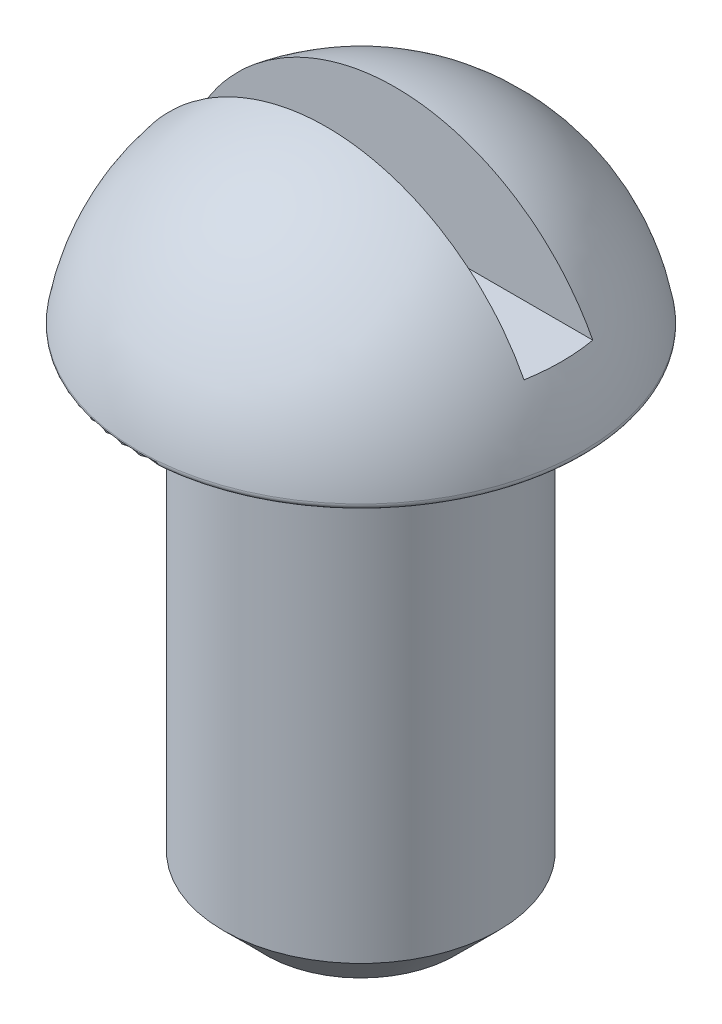
ISO-10303-21;
HEADER;
FILE_DESCRIPTION(('STEP AP214'),'2;1');
FILE_NAME('part.step','',(''),(''),'','','');
FILE_SCHEMA(('AUTOMOTIVE_DESIGN { 1 0 10303 214 1 1 1 1 }'));
ENDSEC;
DATA;
#1=APPLICATION_CONTEXT('core data for automotive mechanical design processes');
#2=APPLICATION_PROTOCOL_DEFINITION('international standard','automotive_design',2000,#1);
#3=PRODUCT_CONTEXT('',#1,'mechanical');
#4=PRODUCT('Part','Part','',(#3));
#5=PRODUCT_RELATED_PRODUCT_CATEGORY('part','',(#4));
#6=PRODUCT_DEFINITION_FORMATION('','',#4);
#7=PRODUCT_DEFINITION_CONTEXT('part definition',#1,'design');
#8=PRODUCT_DEFINITION('design','',#6,#7);
#9=PRODUCT_DEFINITION_SHAPE('','',#8);
#10=(LENGTH_UNIT() NAMED_UNIT(*) SI_UNIT(.MILLI.,.METRE.));
#11=(NAMED_UNIT(*) PLANE_ANGLE_UNIT() SI_UNIT($,.RADIAN.));
#12=(NAMED_UNIT(*) SI_UNIT($,.STERADIAN.) SOLID_ANGLE_UNIT());
#13=UNCERTAINTY_MEASURE_WITH_UNIT(LENGTH_MEASURE(1.E-05),#10,'distance_accuracy_value','');
#14=(GEOMETRIC_REPRESENTATION_CONTEXT(3) GLOBAL_UNCERTAINTY_ASSIGNED_CONTEXT((#13)) GLOBAL_UNIT_ASSIGNED_CONTEXT((#10,
#11,#12)) REPRESENTATION_CONTEXT('',''));
#15=CARTESIAN_POINT('',(0.,0.,0.));
#16=DIRECTION('',(0.,0.,1.));
#17=DIRECTION('',(1.,0.,0.));
#18=AXIS2_PLACEMENT_3D('',#15,#16,#17);
#19=CARTESIAN_POINT('',(0.,87.7311012827133,0.));
#20=DIRECTION('',(0.,1.,0.));
#21=DIRECTION('',(-1.,0.,0.));
#22=AXIS2_PLACEMENT_3D('',#19,#20,#21);
#23=DEGENERATE_TOROIDAL_SURFACE('',#22,0.0358157092389795,6.6,.F.);
#24=CARTESIAN_POINT('',(0.,88.8241552762176,0.));
#25=DIRECTION('',(0.,-1.,0.));
#26=DIRECTION('',(1.,0.,0.));
#27=AXIS2_PLACEMENT_3D('',#24,#25,#26);
#28=CIRCLE('',#27,6.47304232940991);
#29=CARTESIAN_POINT('',(6.4730423294099,88.8241552762176,0.));
#30=VERTEX_POINT('',#29);
#31=EDGE_CURVE('E109',#30,#30,#28,.F.);
#32=ORIENTED_EDGE('',*,*,#31,.T.);
#33=EDGE_LOOP('',(#32));
#34=FACE_BOUND('',#33,.T.);
#35=CARTESIAN_POINT('',(0.,90.7493131400015,0.));
#36=DIRECTION('',(0.,1.,0.));
#37=DIRECTION('',(0.,0.,1.));
#38=AXIS2_PLACEMENT_3D('',#35,#36,#37);
#39=CIRCLE('',#38,5.83363036211429);
#40=CARTESIAN_POINT('',(5.7472813748573,90.7493131400015,0.999999999999999));
#41=VERTEX_POINT('',#40);
#42=CARTESIAN_POINT('',(5.7472813748573,90.7493131400015,-1.));
#43=VERTEX_POINT('',#42);
#44=EDGE_CURVE('E59',#41,#43,#39,.T.);
#45=ORIENTED_EDGE('',*,*,#44,.F.);
#46=CARTESIAN_POINT('',(0.,94.2493131400015,1.));
#47=CARTESIAN_POINT('',(-0.168364600788995,94.2493097063056,1.));
#48=CARTESIAN_POINT('',(-0.336764614827509,94.2425338725873,1.));
#49=CARTESIAN_POINT('',(-0.672512587075678,94.2156406275623,1.));
#50=CARTESIAN_POINT('',(-0.839860019882909,94.1955170162685,1.));
#51=CARTESIAN_POINT('',(-1.34257996888222,94.1149353824897,1.));
#52=CARTESIAN_POINT('',(-1.67494968150842,94.0342740760953,1.));
#53=CARTESIAN_POINT('',(-2.32319170329427,93.8218496667167,1.));
#54=CARTESIAN_POINT('',(-2.63904225223267,93.6900209952112,1.));
#55=CARTESIAN_POINT('',(-3.26755910495227,93.3676156673305,1.));
#56=CARTESIAN_POINT('',(-3.5784596531921,93.1735767044572,1.));
#57=CARTESIAN_POINT('',(-4.16336688716754,92.7362792981311,1.));
#58=CARTESIAN_POINT('',(-4.43737726797557,92.4930257903295,1.));
#59=CARTESIAN_POINT('',(-4.94188801677566,91.96308272381,1.));
#60=CARTESIAN_POINT('',(-5.17221167247878,91.676224867786,1.));
#61=CARTESIAN_POINT('',(-5.58145765988647,91.0679036589879,1.));
#62=CARTESIAN_POINT('',(-5.76037817589664,90.7464390843644,1.));
#63=CARTESIAN_POINT('',(-6.06180216459337,90.0779623416771,1.));
#64=CARTESIAN_POINT('',(-6.18428289306651,89.7309399394924,1.));
#65=CARTESIAN_POINT('',(-6.36924115668387,89.0210602049794,1.));
#66=CARTESIAN_POINT('',(-6.43171901342573,88.6582029575322,1.));
#67=CARTESIAN_POINT('',(-6.47913187611613,88.1102620339645,1.));
#68=CARTESIAN_POINT('',(-6.48721002986995,87.9268979904018,1.));
#69=CARTESIAN_POINT('',(-6.48789872749039,87.5601590038382,1.));
#70=CARTESIAN_POINT('',(-6.48051497722519,87.3767840898207,1.));
#71=CARTESIAN_POINT('',(-6.45032037412489,87.0112534255423,1.));
#72=CARTESIAN_POINT('',(-6.42750381484928,86.8290981514253,1.));
#73=CARTESIAN_POINT('',(-6.36661603526718,86.4674210656236,1.));
#74=CARTESIAN_POINT('',(-6.32855044842673,86.2878983067663,1.));
#75=CARTESIAN_POINT('',(-6.23741635847207,85.9326300027914,1.));
#76=CARTESIAN_POINT('',(-6.1843421444511,85.756885922936,1.));
#77=CARTESIAN_POINT('',(-6.06359675062446,85.4105585109484,1.));
#78=CARTESIAN_POINT('',(-5.99593096575019,85.2399732979403,1.));
#79=CARTESIAN_POINT('',(-5.84644350576554,84.9050459137871,1.));
#80=CARTESIAN_POINT('',(-5.76461654906622,84.7407060999331,1.));
#81=CARTESIAN_POINT('',(-5.58743866370309,84.4195652814166,1.));
#82=CARTESIAN_POINT('',(-5.49209273896502,84.2627615159787,1.));
#83=CARTESIAN_POINT('',(-5.28849624967184,83.9576899389117,1.));
#84=CARTESIAN_POINT('',(-5.18024124146737,83.8094250928008,1.));
#85=CARTESIAN_POINT('',(-4.95166469274388,83.5225981269001,1.));
#86=CARTESIAN_POINT('',(-4.83134762313617,83.3840324441326,1.));
#87=CARTESIAN_POINT('',(-4.57942517498899,83.1174837661509,1.));
#88=CARTESIAN_POINT('',(-4.44781596214704,82.9895043947738,1.));
#89=CARTESIAN_POINT('',(-4.17433055756216,82.7451378815595,1.));
#90=CARTESIAN_POINT('',(-4.03245817855574,82.6287464726252,1.));
#91=CARTESIAN_POINT('',(-3.73938801669753,82.408314235322,1.));
#92=CARTESIAN_POINT('',(-3.58818878440258,82.3042753339841,1.));
#93=CARTESIAN_POINT('',(-3.27761638725377,82.1093485489183,1.));
#94=CARTESIAN_POINT('',(-3.11824626979921,82.0184558098565,1.));
#95=CARTESIAN_POINT('',(-2.79235644915646,81.8503990245377,1.));
#96=CARTESIAN_POINT('',(-2.62583435328378,81.7732396178625,1.));
#97=CARTESIAN_POINT('',(-2.28687145500087,81.633246712472,1.));
#98=CARTESIAN_POINT('',(-2.11443060470902,81.5704133296829,1.));
#99=CARTESIAN_POINT('',(-1.7649532065626,81.4595743448906,1.));
#100=CARTESIAN_POINT('',(-1.58791929248437,81.4115604402123,1.));
#101=CARTESIAN_POINT('',(-1.23041628721557,81.3307067395205,1.));
#102=CARTESIAN_POINT('',(-1.04994717105947,81.2978670538304,1.));
#103=CARTESIAN_POINT('',(-0.686918399405601,81.2477308039299,1.));
#104=CARTESIAN_POINT('',(-0.504359470066674,81.230428997339,1.));
#105=CARTESIAN_POINT('',(-0.138433424931248,81.2117610586447,1.));
#106=CARTESIAN_POINT('',(0.0449336356931564,81.2103938550234,1.));
#107=CARTESIAN_POINT('',(0.407926267112874,81.223531179399,1.));
#108=CARTESIAN_POINT('',(0.587561864101404,81.2377626251395,1.));
#109=CARTESIAN_POINT('',(0.945002655472167,81.2812896524057,1.));
#110=CARTESIAN_POINT('',(1.12280774522417,81.3105860902105,1.));
#111=CARTESIAN_POINT('',(1.47537431337237,81.3838998315108,1.));
#112=CARTESIAN_POINT('',(1.6501354602263,81.4279187281385,1.));
#113=CARTESIAN_POINT('',(1.99546226512214,81.530333467473,1.));
#114=CARTESIAN_POINT('',(2.1660263440498,81.5887346331047,1.));
#115=CARTESIAN_POINT('',(2.50264831497619,81.7198383957288,1.));
#116=CARTESIAN_POINT('',(2.66867626132882,81.7926178883556,1.));
#117=CARTESIAN_POINT('',(2.99415102511854,81.9517831672321,1.));
#118=CARTESIAN_POINT('',(3.15359543158032,82.038173883276,1.));
#119=CARTESIAN_POINT('',(3.46465420270729,82.2238883285555,1.));
#120=CARTESIAN_POINT('',(3.61627254928623,82.3232053884229,1.));
#121=CARTESIAN_POINT('',(3.91077086513253,82.5341528225777,1.));
#122=CARTESIAN_POINT('',(4.05364758775263,82.645787729087,1.));
#123=CARTESIAN_POINT('',(4.33114521833971,82.8818693508057,1.));
#124=CARTESIAN_POINT('',(4.46565682650613,83.0064445735642,1.));
#125=CARTESIAN_POINT('',(4.72376592506991,83.2665220900527,1.));
#126=CARTESIAN_POINT('',(4.84735932542795,83.4020284426011,1.));
#127=CARTESIAN_POINT('',(5.08266643134184,83.6829259995811,1.));
#128=CARTESIAN_POINT('',(5.19438344944847,83.8283144290664,1.));
#129=CARTESIAN_POINT('',(5.4052240657419,84.1280328013535,1.));
#130=CARTESIAN_POINT('',(5.50434299561551,84.2823660280494,0.999999999999999));
#131=CARTESIAN_POINT('',(5.68926860081707,84.5988864795695,0.999999999999999));
#132=CARTESIAN_POINT('',(5.77507053699852,84.7610764735788,0.999999999999999));
#133=CARTESIAN_POINT('',(5.93273966071617,85.0921637845613,0.999999999999999));
#134=CARTESIAN_POINT('',(6.00460168892334,85.2610635571464,0.999999999999999));
#135=CARTESIAN_POINT('',(6.13381547226178,85.6042632311459,0.999999999999999));
#136=CARTESIAN_POINT('',(6.19117289390311,85.7785609937652,0.999999999999999));
#137=CARTESIAN_POINT('',(6.29102538822153,86.1313816409077,0.999999999999999));
#138=CARTESIAN_POINT('',(6.33351496564768,86.3099060616574,0.999999999999999));
#139=CARTESIAN_POINT('',(6.43812787390145,86.8498503717252,0.999999999999999));
#140=CARTESIAN_POINT('',(6.47751597236955,87.2159624773144,0.999999999999999));
#141=CARTESIAN_POINT('',(6.49423907863785,87.9494055895346,0.999999999999999));
#142=CARTESIAN_POINT('',(6.47157387249278,88.3167366003638,0.999999999999999));
#143=CARTESIAN_POINT('',(6.36490463855243,89.0424400512681,0.999999999999999));
#144=CARTESIAN_POINT('',(6.28089949284236,89.4008123279479,0.999999999999999));
#145=CARTESIAN_POINT('',(6.05391064511335,90.0983605844038,0.999999999999999));
#146=CARTESIAN_POINT('',(5.91092561336796,90.4375361311853,0.999999999999999));
#147=CARTESIAN_POINT('',(5.57003345761879,91.0870820336162,0.999999999999999));
#148=CARTESIAN_POINT('',(5.37212427346706,91.3974513081892,1.));
#149=CARTESIAN_POINT('',(4.92702909397013,91.98051149022,1.));
#150=CARTESIAN_POINT('',(4.67984976478793,92.253207486364,1.));
#151=CARTESIAN_POINT('',(4.14330966611572,92.7531361219875,1.));
#152=CARTESIAN_POINT('',(3.8539635562366,92.9803844968148,1.));
#153=CARTESIAN_POINT('',(3.24100871245393,93.383202345997,1.));
#154=CARTESIAN_POINT('',(2.91737851217774,93.5587391789482,1.));
#155=CARTESIAN_POINT('',(2.24510461371918,93.8529605739998,1.));
#156=CARTESIAN_POINT('',(1.8964483624946,93.9716163722521,1.));
#157=CARTESIAN_POINT('',(1.18469830477155,94.1481985716486,1.));
#158=CARTESIAN_POINT('',(0.821641932319893,94.2062729329426,1.));
#159=CARTESIAN_POINT('',(0.304707613220261,94.2437727105078,1.));
#160=CARTESIAN_POINT('',(0.15236830846339,94.2493162474626,1.));
#161=CARTESIAN_POINT('',(0.,94.2493131400015,1.));
#162=B_SPLINE_CURVE_WITH_KNOTS('',3,(#46,#47,#48,#49,#50,#51,#52,#53,#54,#55,#56,#57,#58,#59,
#60,#61,#62,#63,#64,#65,#66,#67,#68,#69,#70,#71,#72,#73,#74,#75,#76,#77,#78,#79,#80,#81,#82,#83,
#84,#85,#86,#87,#88,#89,#90,#91,#92,#93,#94,#95,#96,#97,#98,#99,#100,#101,#102,#103,#104,#105,
#106,#107,#108,#109,#110,#111,#112,#113,#114,#115,#116,#117,#118,#119,#120,#121,#122,#123,#124,
#125,#126,#127,#128,#129,#130,#131,#132,#133,#134,#135,#136,#137,#138,#139,#140,#141,#142,#143,
#144,#145,#146,#147,#148,#149,#150,#151,#152,#153,#154,#155,#156,#157,#158,#159,#160,#161),
.UNSPECIFIED.,.T.,.F.,(4,2,2,2,2,2,2,2,2,2,2,2,2,2,2,2,2,2,2,2,2,2,2,2,2,2,2,2,2,2,2,2,2,2,2,2,
2,2,2,2,2,2,2,2,2,2,2,2,2,2,2,2,2,2,2,2,2,4),(0.,0.505004664153804,1.01024406529592,
2.03164274769624,3.05435464793472,4.14855255160085,5.24264077418811,6.34106435763797,
7.43952673553505,8.53843138761712,9.63733014986245,10.1874208625397,10.7373086123768,
11.2873998001212,11.8372879541698,12.3873856274042,12.9372802610614,13.4873804286424,
14.0372775105171,14.587364430973,15.1372482053783,15.6873194400863,16.2371873640745,
16.787140956834,17.3368909111158,17.8868262383649,18.4367660155395,18.986397125013,
19.5360322304888,20.0854818228742,20.6348944674665,21.1748401000901,21.7148164260761,
22.2548512023629,22.7950861484559,23.3382925606621,23.8816961688076,24.4248205102535,
24.9681453591822,25.5175037960906,26.0670671615976,26.6164768389346,27.1660895141232,
27.715897334859,28.2659082594997,28.8157039784342,29.3657026912946,30.4646839010472,
31.5636688998344,32.6626739280225,33.7617037350977,34.8607747712132,35.9596972057836,
37.0582384987901,38.1574717354358,39.2572602522702,40.3543563834213,40.811380639605),.UNSPECIFIED.);
#163=CARTESIAN_POINT('',(-5.74728137485732,90.7493131400015,1.));
#164=VERTEX_POINT('',#163);
#165=EDGE_CURVE('E57',#41,#164,#162,.T.);
#166=ORIENTED_EDGE('',*,*,#165,.T.);
#167=CARTESIAN_POINT('',(-5.74728137485732,90.7493131400015,-0.999999999999999));
#168=VERTEX_POINT('',#167);
#169=EDGE_CURVE('E58',#168,#164,#39,.T.);
#170=ORIENTED_EDGE('',*,*,#169,.F.);
#171=CARTESIAN_POINT('',(0.,94.2493131400015,-1.));
#172=CARTESIAN_POINT('',(0.168364600788981,94.2493097063056,-1.));
#173=CARTESIAN_POINT('',(0.336764614827495,94.2425338725873,-1.));
#174=CARTESIAN_POINT('',(0.672512587075663,94.2156406275623,-1.));
#175=CARTESIAN_POINT('',(0.839860019882895,94.1955170162685,-1.));
#176=CARTESIAN_POINT('',(1.34257996888221,94.1149353824897,-1.));
#177=CARTESIAN_POINT('',(1.67494968150841,94.0342740760953,-1.));
#178=CARTESIAN_POINT('',(2.32319170329425,93.8218496667167,-1.));
#179=CARTESIAN_POINT('',(2.63904225223266,93.6900209952112,-1.));
#180=CARTESIAN_POINT('',(3.26755910495226,93.3676156673305,-1.));
#181=CARTESIAN_POINT('',(3.57845965319209,93.1735767044572,-1.));
#182=CARTESIAN_POINT('',(4.16336688716753,92.7362792981311,-1.));
#183=CARTESIAN_POINT('',(4.43737726797556,92.4930257903295,-1.));
#184=CARTESIAN_POINT('',(4.94188801677564,91.96308272381,-1.));
#185=CARTESIAN_POINT('',(5.17221167247877,91.676224867786,-1.));
#186=CARTESIAN_POINT('',(5.58145765988646,91.0679036589879,-1.));
#187=CARTESIAN_POINT('',(5.76037817589663,90.7464390843644,-1.));
#188=CARTESIAN_POINT('',(6.06180216459336,90.0779623416771,-1.));
#189=CARTESIAN_POINT('',(6.18428289306649,89.7309399394924,-1.));
#190=CARTESIAN_POINT('',(6.36924115668385,89.0210602049794,-1.));
#191=CARTESIAN_POINT('',(6.43171901342571,88.6582029575323,-1.));
#192=CARTESIAN_POINT('',(6.47913187611612,88.1102620339645,-1.));
#193=CARTESIAN_POINT('',(6.48721002986994,87.9268979904018,-1.));
#194=CARTESIAN_POINT('',(6.48789872749038,87.5601590038382,-1.));
#195=CARTESIAN_POINT('',(6.48051497722518,87.3767840898207,-1.));
#196=CARTESIAN_POINT('',(6.45032037412488,87.0112534255423,-1.));
#197=CARTESIAN_POINT('',(6.42750381484927,86.8290981514253,-1.));
#198=CARTESIAN_POINT('',(6.36661603526716,86.4674210656236,-1.));
#199=CARTESIAN_POINT('',(6.32855044842672,86.2878983067663,-1.));
#200=CARTESIAN_POINT('',(6.23741635847206,85.9326300027914,-1.));
#201=CARTESIAN_POINT('',(6.18434214445109,85.756885922936,-1.));
#202=CARTESIAN_POINT('',(6.06359675062444,85.4105585109484,-1.));
#203=CARTESIAN_POINT('',(5.99593096575018,85.2399732979403,-1.));
#204=CARTESIAN_POINT('',(5.84644350576553,84.9050459137871,-1.));
#205=CARTESIAN_POINT('',(5.76461654906621,84.7407060999331,-1.));
#206=CARTESIAN_POINT('',(5.58743866370308,84.4195652814166,-1.));
#207=CARTESIAN_POINT('',(5.49209273896501,84.2627615159787,-1.));
#208=CARTESIAN_POINT('',(5.28849624967183,83.9576899389117,-1.));
#209=CARTESIAN_POINT('',(5.18024124146736,83.8094250928008,-1.));
#210=CARTESIAN_POINT('',(4.95166469274387,83.5225981269001,-1.));
#211=CARTESIAN_POINT('',(4.83134762313616,83.3840324441326,-1.));
#212=CARTESIAN_POINT('',(4.57942517498898,83.1174837661509,-1.));
#213=CARTESIAN_POINT('',(4.44781596214703,82.9895043947738,-1.));
#214=CARTESIAN_POINT('',(4.17433055756215,82.7451378815595,-1.));
#215=CARTESIAN_POINT('',(4.03245817855573,82.6287464726252,-1.));
#216=CARTESIAN_POINT('',(3.73938801669752,82.408314235322,-1.));
#217=CARTESIAN_POINT('',(3.58818878440257,82.3042753339841,-1.));
#218=CARTESIAN_POINT('',(3.27761638725376,82.1093485489183,-1.));
#219=CARTESIAN_POINT('',(3.1182462697992,82.0184558098565,-1.));
#220=CARTESIAN_POINT('',(2.79235644915645,81.8503990245377,-1.));
#221=CARTESIAN_POINT('',(2.62583435328376,81.7732396178625,-1.));
#222=CARTESIAN_POINT('',(2.28687145500086,81.633246712472,-1.));
#223=CARTESIAN_POINT('',(2.11443060470901,81.5704133296829,-1.));
#224=CARTESIAN_POINT('',(1.76495320656259,81.4595743448906,-1.));
#225=CARTESIAN_POINT('',(1.58791929248436,81.4115604402123,-1.));
#226=CARTESIAN_POINT('',(1.23041628721556,81.3307067395205,-1.));
#227=CARTESIAN_POINT('',(1.04994717105946,81.2978670538304,-1.));
#228=CARTESIAN_POINT('',(0.68691839940559,81.2477308039299,-1.));
#229=CARTESIAN_POINT('',(0.504359470066663,81.230428997339,-1.));
#230=CARTESIAN_POINT('',(0.138433424931237,81.2117610586447,-1.));
#231=CARTESIAN_POINT('',(-0.044933635693168,81.2103938550233,-1.));
#232=CARTESIAN_POINT('',(-0.407926267112888,81.223531179399,-1.));
#233=CARTESIAN_POINT('',(-0.587561864101419,81.2377626251395,-1.));
#234=CARTESIAN_POINT('',(-0.945002655472183,81.2812896524058,-1.));
#235=CARTESIAN_POINT('',(-1.12280774522419,81.3105860902105,-1.));
#236=CARTESIAN_POINT('',(-1.47537431337239,81.3838998315108,-1.));
#237=CARTESIAN_POINT('',(-1.65013546022632,81.4279187281385,-1.));
#238=CARTESIAN_POINT('',(-1.99546226512215,81.530333467473,-1.));
#239=CARTESIAN_POINT('',(-2.16602634404981,81.5887346331047,-1.));
#240=CARTESIAN_POINT('',(-2.5026483149762,81.7198383957288,-1.));
#241=CARTESIAN_POINT('',(-2.66867626132883,81.7926178883556,-1.));
#242=CARTESIAN_POINT('',(-2.99415102511856,81.9517831672321,-1.));
#243=CARTESIAN_POINT('',(-3.15359543158033,82.038173883276,-0.999999999999999));
#244=CARTESIAN_POINT('',(-3.4646542027073,82.2238883285555,-0.999999999999999));
#245=CARTESIAN_POINT('',(-3.61627254928625,82.3232053884229,-0.999999999999999));
#246=CARTESIAN_POINT('',(-3.91077086513255,82.5341528225777,-0.999999999999999));
#247=CARTESIAN_POINT('',(-4.05364758775264,82.645787729087,-0.999999999999999));
#248=CARTESIAN_POINT('',(-4.33114521833972,82.8818693508057,-0.999999999999999));
#249=CARTESIAN_POINT('',(-4.46565682650614,83.0064445735642,-0.999999999999999));
#250=CARTESIAN_POINT('',(-4.72376592506992,83.2665220900527,-0.999999999999999));
#251=CARTESIAN_POINT('',(-4.84735932542796,83.4020284426011,-0.999999999999999));
#252=CARTESIAN_POINT('',(-5.08266643134185,83.6829259995811,-0.999999999999999));
#253=CARTESIAN_POINT('',(-5.19438344944848,83.8283144290664,-0.999999999999999));
#254=CARTESIAN_POINT('',(-5.40522406574192,84.1280328013535,-0.999999999999999));
#255=CARTESIAN_POINT('',(-5.50434299561552,84.2823660280494,-0.999999999999999));
#256=CARTESIAN_POINT('',(-5.68926860081708,84.5988864795695,-0.999999999999999));
#257=CARTESIAN_POINT('',(-5.77507053699853,84.7610764735788,-0.999999999999999));
#258=CARTESIAN_POINT('',(-5.93273966071618,85.0921637845613,-0.999999999999999));
#259=CARTESIAN_POINT('',(-6.00460168892335,85.2610635571464,-0.999999999999999));
#260=CARTESIAN_POINT('',(-6.13381547226179,85.6042632311459,-0.999999999999999));
#261=CARTESIAN_POINT('',(-6.19117289390312,85.7785609937652,-0.999999999999999));
#262=CARTESIAN_POINT('',(-6.29102538822154,86.1313816409077,-0.999999999999999));
#263=CARTESIAN_POINT('',(-6.3335149656477,86.3099060616574,-0.999999999999999));
#264=CARTESIAN_POINT('',(-6.43812787390146,86.8498503717252,-0.999999999999999));
#265=CARTESIAN_POINT('',(-6.47751597236956,87.2159624773144,-0.999999999999999));
#266=CARTESIAN_POINT('',(-6.49423907863786,87.9494055895346,-0.999999999999999));
#267=CARTESIAN_POINT('',(-6.47157387249279,88.3167366003638,-0.999999999999999));
#268=CARTESIAN_POINT('',(-6.36490463855244,89.0424400512681,-0.999999999999999));
#269=CARTESIAN_POINT('',(-6.28089949284237,89.4008123279479,-0.999999999999999));
#270=CARTESIAN_POINT('',(-6.05391064511337,90.0983605844038,-0.999999999999999));
#271=CARTESIAN_POINT('',(-5.91092561336797,90.4375361311853,-0.999999999999999));
#272=CARTESIAN_POINT('',(-5.5700334576188,91.0870820336162,-0.999999999999999));
#273=CARTESIAN_POINT('',(-5.37212427346707,91.3974513081892,-0.999999999999999));
#274=CARTESIAN_POINT('',(-4.92702909397015,91.98051149022,-0.999999999999999));
#275=CARTESIAN_POINT('',(-4.67984976478794,92.253207486364,-0.999999999999999));
#276=CARTESIAN_POINT('',(-4.14330966611573,92.7531361219875,-0.999999999999999));
#277=CARTESIAN_POINT('',(-3.85396355623662,92.9803844968148,-0.999999999999999));
#278=CARTESIAN_POINT('',(-3.24100871245394,93.383202345997,-0.999999999999999));
#279=CARTESIAN_POINT('',(-2.91737851217775,93.5587391789482,-1.));
#280=CARTESIAN_POINT('',(-2.2451046137192,93.8529605739998,-1.));
#281=CARTESIAN_POINT('',(-1.89644836249462,93.9716163722521,-1.));
#282=CARTESIAN_POINT('',(-1.18469830477156,94.1481985716486,-1.));
#283=CARTESIAN_POINT('',(-0.821641932319907,94.2062729329426,-1.));
#284=CARTESIAN_POINT('',(-0.304707613220275,94.2437727105078,-1.));
#285=CARTESIAN_POINT('',(-0.152368308463405,94.2493162474626,-1.));
#286=CARTESIAN_POINT('',(0.,94.2493131400015,-1.));
#287=B_SPLINE_CURVE_WITH_KNOTS('',3,(#171,#172,#173,#174,#175,#176,#177,#178,#179,#180,#181,
#182,#183,#184,#185,#186,#187,#188,#189,#190,#191,#192,#193,#194,#195,#196,#197,#198,#199,#200,
#201,#202,#203,#204,#205,#206,#207,#208,#209,#210,#211,#212,#213,#214,#215,#216,#217,#218,#219,
#220,#221,#222,#223,#224,#225,#226,#227,#228,#229,#230,#231,#232,#233,#234,#235,#236,#237,#238,
#239,#240,#241,#242,#243,#244,#245,#246,#247,#248,#249,#250,#251,#252,#253,#254,#255,#256,#257,
#258,#259,#260,#261,#262,#263,#264,#265,#266,#267,#268,#269,#270,#271,#272,#273,#274,#275,#276,
#277,#278,#279,#280,#281,#282,#283,#284,#285,#286),.UNSPECIFIED.,.T.,.F.,(4,2,2,2,2,2,2,2,2,2,2,
2,2,2,2,2,2,2,2,2,2,2,2,2,2,2,2,2,2,2,2,2,2,2,2,2,2,2,2,2,2,2,2,2,2,2,2,2,2,2,2,2,2,2,2,2,2,4),
(0.,0.505004664153804,1.01024406529592,2.03164274769624,3.05435464793472,4.14855255160085,
5.24264077418811,6.34106435763797,7.43952673553506,8.53843138761709,9.63733014986245,
10.1874208625397,10.7373086123768,11.2873998001212,11.8372879541698,12.3873856274042,
12.9372802610614,13.4873804286424,14.0372775105171,14.587364430973,15.1372482053783,
15.6873194400863,16.2371873640745,16.787140956834,17.3368909111158,17.8868262383649,
18.4367660155395,18.986397125013,19.5360322304888,20.0854818228742,20.6348944674665,
21.1748401000901,21.7148164260761,22.2548512023629,22.795086148456,23.3382925606621,
23.8816961688076,24.4248205102535,24.9681453591822,25.5175037960906,26.0670671615976,
26.6164768389347,27.1660895141232,27.715897334859,28.2659082594997,28.8157039784342,
29.3657026912947,30.4646839010473,31.5636688998345,32.6626739280225,33.7617037350977,
34.8607747712132,35.9596972057836,37.0582384987901,38.1574717354358,39.2572602522702,
40.3543563834213,40.811380639605),.UNSPECIFIED.);
#288=EDGE_CURVE('E51',#168,#43,#287,.T.);
#289=ORIENTED_EDGE('',*,*,#288,.T.);
#290=EDGE_LOOP('',(#45,#166,#170,#289));
#291=FACE_BOUND('',#290,.T.);
#292=ADVANCED_FACE('F29',(#34,#291),#23,.F.);
#293=CARTESIAN_POINT('',(4.,88.6493131400015,0.));
#294=DIRECTION('',(0.,1.,0.));
#295=DIRECTION('',(-1.,0.,0.));
#296=AXIS2_PLACEMENT_3D('',#293,#294,#295);
#297=PLANE('',#296);
#298=CARTESIAN_POINT('',(0.,88.6493131400015,0.));
#299=DIRECTION('',(0.,1.,0.));
#300=DIRECTION('',(-1.,0.,0.));
#301=AXIS2_PLACEMENT_3D('',#298,#299,#300);
#302=CIRCLE('',#301,6.32511373762244);
#303=CARTESIAN_POINT('',(-6.32511373762244,88.6493131400015,0.));
#304=VERTEX_POINT('',#303);
#305=EDGE_CURVE('E104',#304,#304,#302,.F.);
#306=ORIENTED_EDGE('',*,*,#305,.T.);
#307=EDGE_LOOP('',(#306));
#308=FACE_BOUND('',#307,.T.);
#309=CARTESIAN_POINT('',(0.,88.6493131400015,0.));
#310=DIRECTION('',(0.,1.,0.));
#311=DIRECTION('',(-1.,0.,0.));
#312=AXIS2_PLACEMENT_3D('',#309,#310,#311);
#313=CIRCLE('',#312,4.00000000000001);
#314=CARTESIAN_POINT('',(-4.00000000000002,88.6493131400015,0.));
#315=VERTEX_POINT('',#314);
#316=EDGE_CURVE('E66',#315,#315,#313,.T.);
#317=ORIENTED_EDGE('',*,*,#316,.T.);
#318=EDGE_LOOP('',(#317));
#319=FACE_BOUND('',#318,.T.);
#320=ADVANCED_FACE('F92',(#308,#319),#297,.F.);
#321=CARTESIAN_POINT('',(0.,125.763182897862,0.));
#322=DIRECTION('',(0.,1.,0.));
#323=DIRECTION('',(-1.,0.,0.));
#324=AXIS2_PLACEMENT_3D('',#321,#322,#323);
#325=CYLINDRICAL_SURFACE('',#324,4.00000000000001);
#326=CARTESIAN_POINT('',(0.,75.4993131400015,0.));
#327=DIRECTION('',(0.,1.,0.));
#328=DIRECTION('',(-1.,0.,0.));
#329=AXIS2_PLACEMENT_3D('',#326,#327,#328);
#330=CIRCLE('',#329,4.00000000000001);
#331=CARTESIAN_POINT('',(-4.00000000000002,75.4993131400015,0.));
#332=VERTEX_POINT('',#331);
#333=EDGE_CURVE('E37',#332,#332,#330,.T.);
#334=ORIENTED_EDGE('',*,*,#333,.T.);
#335=EDGE_LOOP('',(#334));
#336=FACE_BOUND('',#335,.T.);
#337=ORIENTED_EDGE('',*,*,#316,.F.);
#338=EDGE_LOOP('',(#337));
#339=FACE_BOUND('',#338,.T.);
#340=ADVANCED_FACE('F89',(#336,#339),#325,.T.);
#341=CARTESIAN_POINT('',(4.00000000000001,74.2493131400015,0.));
#342=DIRECTION('',(0.,1.,0.));
#343=DIRECTION('',(-1.,0.,0.));
#344=AXIS2_PLACEMENT_3D('',#341,#342,#343);
#345=PLANE('',#344);
#346=CARTESIAN_POINT('',(0.,74.2493131400015,0.));
#347=DIRECTION('',(0.,1.,0.));
#348=DIRECTION('',(-1.,0.,0.));
#349=AXIS2_PLACEMENT_3D('',#346,#347,#348);
#350=CIRCLE('',#349,2.75000000000001);
#351=CARTESIAN_POINT('',(-2.75000000000001,74.2493131400015,0.));
#352=VERTEX_POINT('',#351);
#353=EDGE_CURVE('E11',#352,#352,#350,.F.);
#354=ORIENTED_EDGE('',*,*,#353,.T.);
#355=EDGE_LOOP('',(#354));
#356=FACE_BOUND('',#355,.T.);
#357=ADVANCED_FACE('F86',(#356),#345,.F.);
#358=CARTESIAN_POINT('',(-6.50000000000001,90.7493131400015,-0.999999999999999));
#359=DIRECTION('',(0.,1.,0.));
#360=DIRECTION('',(0.,0.,1.));
#361=AXIS2_PLACEMENT_3D('',#358,#359,#360);
#362=PLANE('',#361);
#363=ORIENTED_EDGE('',*,*,#44,.T.);
#364=DIRECTION('',(-1.,0.,0.));
#365=VECTOR('',#364,1.);
#366=CARTESIAN_POINT('',(-6.50000000000001,90.7493131400015,-0.999999999999999));
#367=LINE('',#366,#365);
#368=EDGE_CURVE('E44',#43,#168,#367,.T.);
#369=ORIENTED_EDGE('',*,*,#368,.T.);
#370=ORIENTED_EDGE('',*,*,#169,.T.);
#371=DIRECTION('',(1.,0.,0.));
#372=VECTOR('',#371,1.);
#373=CARTESIAN_POINT('',(-6.50000000000001,90.7493131400015,1.));
#374=LINE('',#373,#372);
#375=EDGE_CURVE('E65',#164,#41,#374,.T.);
#376=ORIENTED_EDGE('',*,*,#375,.T.);
#377=EDGE_LOOP('',(#363,#369,#370,#376));
#378=FACE_BOUND('',#377,.T.);
#379=ADVANCED_FACE('F64',(#378),#362,.T.);
#380=CARTESIAN_POINT('',(-6.50000000000001,90.7493131400015,-0.999999999999999));
#381=DIRECTION('',(0.,0.,-1.));
#382=DIRECTION('',(-1.,0.,0.));
#383=AXIS2_PLACEMENT_3D('',#380,#381,#382);
#384=PLANE('',#383);
#385=ORIENTED_EDGE('',*,*,#288,.F.);
#386=ORIENTED_EDGE('',*,*,#368,.F.);
#387=EDGE_LOOP('',(#385,#386));
#388=FACE_BOUND('',#387,.T.);
#389=ADVANCED_FACE('F83',(#388),#384,.F.);
#390=CARTESIAN_POINT('',(-6.50000000000001,90.7493131400015,1.));
#391=DIRECTION('',(0.,0.,1.));
#392=DIRECTION('',(1.,0.,0.));
#393=AXIS2_PLACEMENT_3D('',#390,#391,#392);
#394=PLANE('',#393);
#395=ORIENTED_EDGE('',*,*,#165,.F.);
#396=ORIENTED_EDGE('',*,*,#375,.F.);
#397=EDGE_LOOP('',(#395,#396));
#398=FACE_BOUND('',#397,.T.);
#399=ADVANCED_FACE('F68',(#398),#394,.F.);
#400=CARTESIAN_POINT('',(0.,88.7993131400015,0.));
#401=DIRECTION('',(0.,1.,0.));
#402=DIRECTION('',(-1.,0.,0.));
#403=AXIS2_PLACEMENT_3D('',#400,#401,#402);
#404=TOROIDAL_SURFACE('',#403,6.32511373762244,0.15);
#405=ORIENTED_EDGE('',*,*,#305,.F.);
#406=EDGE_LOOP('',(#405));
#407=FACE_BOUND('',#406,.T.);
#408=ORIENTED_EDGE('',*,*,#31,.F.);
#409=EDGE_LOOP('',(#408));
#410=FACE_BOUND('',#409,.T.);
#411=ADVANCED_FACE('F82',(#407,#410),#404,.T.);
#412=CARTESIAN_POINT('',(0.,75.4993131400015,0.));
#413=DIRECTION('',(0.,1.,0.));
#414=DIRECTION('',(-1.,0.,0.));
#415=AXIS2_PLACEMENT_3D('',#412,#413,#414);
#416=CONICAL_SURFACE('',#415,4.00000000000001,0.785398163397443);
#417=ORIENTED_EDGE('',*,*,#353,.F.);
#418=EDGE_LOOP('',(#417));
#419=FACE_BOUND('',#418,.T.);
#420=ORIENTED_EDGE('',*,*,#333,.F.);
#421=EDGE_LOOP('',(#420));
#422=FACE_BOUND('',#421,.T.);
#423=ADVANCED_FACE('F115',(#419,#422),#416,.T.);
#424=CLOSED_SHELL('',(#292,#320,#340,#357,#379,#389,#399,#411,#423));
#425=MANIFOLD_SOLID_BREP('B2',#424);
#426=ADVANCED_BREP_SHAPE_REPRESENTATION('',(#18,#425),#14);
#427=SHAPE_DEFINITION_REPRESENTATION(#9,#426);
ENDSEC;
END-ISO-10303-21;
